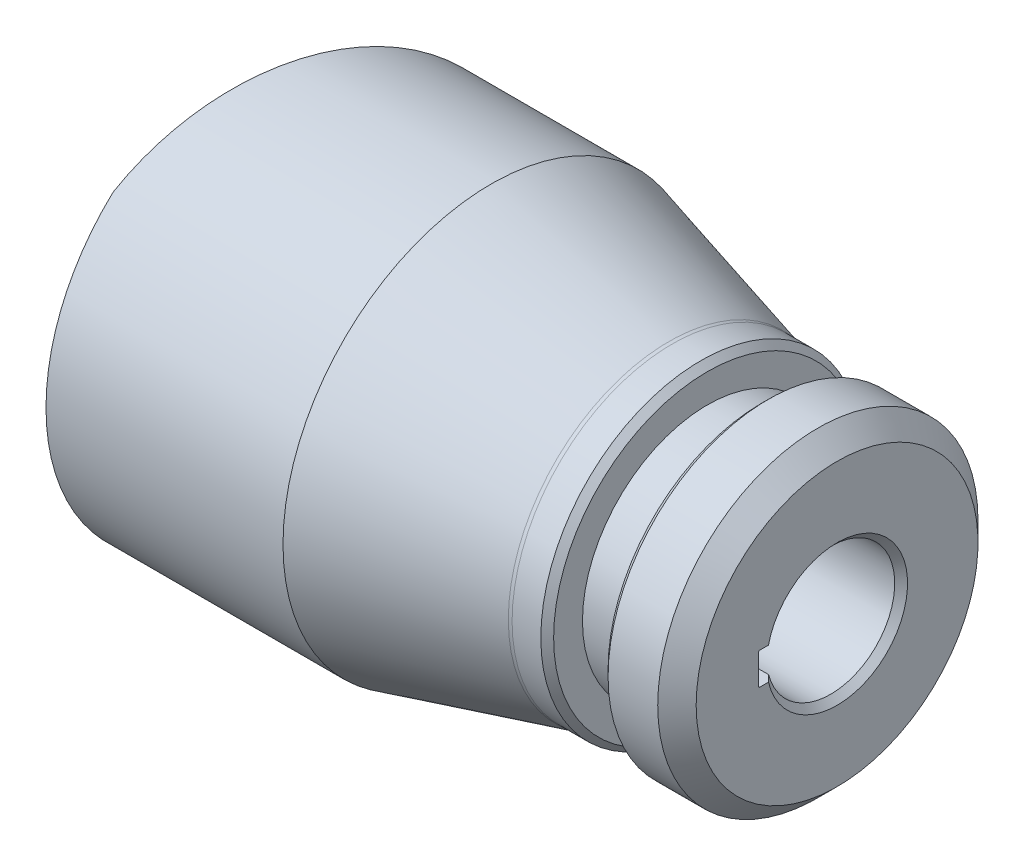
ISO-10303-21;
HEADER;
FILE_DESCRIPTION(('STEP AP214'),'2;1');
FILE_NAME('part.step','',(''),(''),'','','');
FILE_SCHEMA(('AUTOMOTIVE_DESIGN { 1 0 10303 214 1 1 1 1 }'));
ENDSEC;
DATA;
#1=APPLICATION_CONTEXT('core data for automotive mechanical design processes');
#2=APPLICATION_PROTOCOL_DEFINITION('international standard','automotive_design',2000,#1);
#3=PRODUCT_CONTEXT('',#1,'mechanical');
#4=PRODUCT('Part','Part','',(#3));
#5=PRODUCT_RELATED_PRODUCT_CATEGORY('part','',(#4));
#6=PRODUCT_DEFINITION_FORMATION('','',#4);
#7=PRODUCT_DEFINITION_CONTEXT('part definition',#1,'design');
#8=PRODUCT_DEFINITION('design','',#6,#7);
#9=PRODUCT_DEFINITION_SHAPE('','',#8);
#10=(LENGTH_UNIT() NAMED_UNIT(*) SI_UNIT(.MILLI.,.METRE.));
#11=(NAMED_UNIT(*) PLANE_ANGLE_UNIT() SI_UNIT($,.RADIAN.));
#12=(NAMED_UNIT(*) SI_UNIT($,.STERADIAN.) SOLID_ANGLE_UNIT());
#13=UNCERTAINTY_MEASURE_WITH_UNIT(LENGTH_MEASURE(1.E-05),#10,'distance_accuracy_value','');
#14=(GEOMETRIC_REPRESENTATION_CONTEXT(3) GLOBAL_UNCERTAINTY_ASSIGNED_CONTEXT((#13)) GLOBAL_UNIT_ASSIGNED_CONTEXT((#10,
#11,#12)) REPRESENTATION_CONTEXT('',''));
#15=CARTESIAN_POINT('',(0.,0.,0.));
#16=DIRECTION('',(0.,0.,1.));
#17=DIRECTION('',(1.,0.,0.));
#18=AXIS2_PLACEMENT_3D('',#15,#16,#17);
#19=CARTESIAN_POINT('',(61.,10.,0.));
#20=DIRECTION('',(1.,0.,0.));
#21=DIRECTION('',(0.,0.,-1.));
#22=AXIS2_PLACEMENT_3D('',#19,#20,#21);
#23=PLANE('',#22);
#24=CARTESIAN_POINT('',(61.,0.,0.));
#25=DIRECTION('',(-1.,0.,0.));
#26=DIRECTION('',(0.,0.,1.));
#27=AXIS2_PLACEMENT_3D('',#24,#25,#26);
#28=CIRCLE('',#27,19.);
#29=CARTESIAN_POINT('',(61.,0.,19.));
#30=VERTEX_POINT('',#29);
#31=EDGE_CURVE('E228',#30,#30,#28,.T.);
#32=ORIENTED_EDGE('',*,*,#31,.T.);
#33=EDGE_LOOP('',(#32));
#34=FACE_BOUND('',#33,.T.);
#35=CARTESIAN_POINT('',(61.,-2.25,12.05));
#36=DIRECTION('',(1.,0.,0.));
#37=DIRECTION('',(0.,0.,-1.));
#38=AXIS2_PLACEMENT_3D('',#35,#36,#37);
#39=CIRCLE('',#38,0.25);
#40=CARTESIAN_POINT('',(61.,-2.25,12.3));
#41=VERTEX_POINT('',#40);
#42=CARTESIAN_POINT('',(61.,-2.5,12.05));
#43=VERTEX_POINT('',#42);
#44=EDGE_CURVE('E137',#41,#43,#39,.T.);
#45=ORIENTED_EDGE('',*,*,#44,.T.);
#46=DIRECTION('',(0.,0.,-1.));
#47=VECTOR('',#46,1.);
#48=CARTESIAN_POINT('',(61.,-2.5,12.05));
#49=LINE('',#48,#47);
#50=CARTESIAN_POINT('',(61.,-2.5,9.68245836551854));
#51=VERTEX_POINT('',#50);
#52=EDGE_CURVE('E132',#43,#51,#49,.T.);
#53=ORIENTED_EDGE('',*,*,#52,.T.);
#54=CARTESIAN_POINT('',(61.,0.,0.));
#55=DIRECTION('',(-1.,0.,0.));
#56=DIRECTION('',(0.,0.,1.));
#57=AXIS2_PLACEMENT_3D('',#54,#55,#56);
#58=CIRCLE('',#57,10.);
#59=CARTESIAN_POINT('',(61.,2.5,9.68245836551854));
#60=VERTEX_POINT('',#59);
#61=EDGE_CURVE('E131',#60,#51,#58,.T.);
#62=ORIENTED_EDGE('',*,*,#61,.F.);
#63=DIRECTION('',(0.,0.,1.));
#64=VECTOR('',#63,1.);
#65=CARTESIAN_POINT('',(61.,2.5,0.));
#66=LINE('',#65,#64);
#67=CARTESIAN_POINT('',(61.,2.5,12.05));
#68=VERTEX_POINT('',#67);
#69=EDGE_CURVE('E115',#60,#68,#66,.T.);
#70=ORIENTED_EDGE('',*,*,#69,.T.);
#71=CARTESIAN_POINT('',(61.,2.25,12.05));
#72=DIRECTION('',(1.,0.,0.));
#73=DIRECTION('',(0.,0.,-1.));
#74=AXIS2_PLACEMENT_3D('',#71,#72,#73);
#75=CIRCLE('',#74,0.25);
#76=CARTESIAN_POINT('',(61.,2.25,12.3));
#77=VERTEX_POINT('',#76);
#78=EDGE_CURVE('E122',#68,#77,#75,.T.);
#79=ORIENTED_EDGE('',*,*,#78,.T.);
#80=DIRECTION('',(0.,-1.,0.));
#81=VECTOR('',#80,1.);
#82=CARTESIAN_POINT('',(61.,2.25,12.3));
#83=LINE('',#82,#81);
#84=EDGE_CURVE('E130',#77,#41,#83,.T.);
#85=ORIENTED_EDGE('',*,*,#84,.T.);
#86=EDGE_LOOP('',(#45,#53,#62,#70,#79,#85));
#87=FACE_BOUND('',#86,.T.);
#88=ADVANCED_FACE('F39',(#34,#87),#23,.F.);
#89=CARTESIAN_POINT('',(0.,0.,0.));
#90=DIRECTION('',(-1.,0.,0.));
#91=DIRECTION('',(0.,0.,1.));
#92=AXIS2_PLACEMENT_3D('',#89,#90,#91);
#93=CYLINDRICAL_SURFACE('',#92,10.);
#94=DIRECTION('',(-1.,0.,0.));
#95=VECTOR('',#94,1.);
#96=CARTESIAN_POINT('',(0.,-2.5,9.68245836551854));
#97=LINE('',#96,#95);
#98=CARTESIAN_POINT('',(90.,-2.5,9.68245836551854));
#99=VERTEX_POINT('',#98);
#100=EDGE_CURVE('E177',#99,#51,#97,.T.);
#101=ORIENTED_EDGE('',*,*,#100,.F.);
#102=CARTESIAN_POINT('',(90.,0.,0.));
#103=DIRECTION('',(-1.,0.,0.));
#104=DIRECTION('',(0.,0.,1.));
#105=AXIS2_PLACEMENT_3D('',#102,#103,#104);
#106=CIRCLE('',#105,10.);
#107=CARTESIAN_POINT('',(90.,2.5,9.68245836551854));
#108=VERTEX_POINT('',#107);
#109=EDGE_CURVE('E225',#108,#99,#106,.T.);
#110=ORIENTED_EDGE('',*,*,#109,.F.);
#111=DIRECTION('',(-1.,0.,0.));
#112=VECTOR('',#111,1.);
#113=CARTESIAN_POINT('',(0.,2.5,9.68245836551854));
#114=LINE('',#113,#112);
#115=EDGE_CURVE('E155',#60,#108,#114,.F.);
#116=ORIENTED_EDGE('',*,*,#115,.F.);
#117=ORIENTED_EDGE('',*,*,#61,.T.);
#118=EDGE_LOOP('',(#101,#110,#116,#117));
#119=FACE_BOUND('',#118,.T.);
#120=ADVANCED_FACE('F266',(#119),#93,.F.);
#121=CARTESIAN_POINT('',(90.,0.,0.));
#122=DIRECTION('',(1.,0.,0.));
#123=DIRECTION('',(0.,0.,-1.));
#124=AXIS2_PLACEMENT_3D('',#121,#122,#123);
#125=CONICAL_SURFACE('',#124,10.,0.785398163397447);
#126=CARTESIAN_POINT('',(102.045561017187,-2.5,21.9033504414856));
#127=CARTESIAN_POINT('',(101.449870446215,-2.5,21.3037783460764));
#128=CARTESIAN_POINT('',(100.854324898053,-2.5,20.7040619931697));
#129=CARTESIAN_POINT('',(99.6635375559575,-2.5,19.5041110312237));
#130=CARTESIAN_POINT('',(99.0682958370964,-2.5,18.9038763476916));
#131=CARTESIAN_POINT('',(97.8760221457398,-2.5,17.7005309154406));
#132=CARTESIAN_POINT('',(97.2789922658939,-2.5,17.0974180929501));
#133=CARTESIAN_POINT('',(96.0857744996463,-2.5,15.8905745919997));
#134=CARTESIAN_POINT('',(95.4895864810006,-2.5,15.2868440443333));
#135=CARTESIAN_POINT('',(94.4346485898976,-2.5,14.2167217543766));
#136=CARTESIAN_POINT('',(93.9756881287908,-2.5,13.7505376591703));
#137=CARTESIAN_POINT('',(93.0585903370607,-2.5,12.8173416722738));
#138=CARTESIAN_POINT('',(92.6004530233315,-2.5,12.3503297639757));
#139=CARTESIAN_POINT('',(91.6850309742706,-2.5,11.4148702783134));
#140=CARTESIAN_POINT('',(91.2277469954926,-2.5,10.9464219600604));
#141=CARTESIAN_POINT('',(90.3148861875787,-2.5,10.0079342569333));
#142=CARTESIAN_POINT('',(89.8593092298857,-2.5,9.53789499716365));
#143=CARTESIAN_POINT('',(88.9523494751294,-2.5,8.59711263543488));
#144=CARTESIAN_POINT('',(88.5009574133,-2.5,8.12637848838384));
#145=CARTESIAN_POINT('',(87.8269019453231,-2.5,7.4172560158198));
#146=CARTESIAN_POINT('',(87.6026883899942,-2.5,7.18034208959313));
#147=CARTESIAN_POINT('',(87.1556525924263,-2.5,6.70521258252492));
#148=CARTESIAN_POINT('',(86.9328303232039,-2.5,6.46699702709683));
#149=CARTESIAN_POINT('',(86.4893544719267,-2.5,5.98912775716134));
#150=CARTESIAN_POINT('',(86.2686984487696,-2.5,5.74947631274653));
#151=CARTESIAN_POINT('',(85.8300192665262,-2.5,5.26773614577968));
#152=CARTESIAN_POINT('',(85.6119963259971,-2.5,5.02564722392351));
#153=CARTESIAN_POINT('',(85.1799421292042,-2.5,4.53813526469688));
#154=CARTESIAN_POINT('',(84.9659088435389,-2.5,4.29271403860861));
#155=CARTESIAN_POINT('',(84.6494717760518,-2.5,3.92068538051081));
#156=CARTESIAN_POINT('',(84.544768684024,-2.5,3.7960351611092));
#157=CARTESIAN_POINT('',(84.3373550207405,-2.5,3.54509019573787));
#158=CARTESIAN_POINT('',(84.2346443575069,-2.5,3.41879552613407));
#159=CARTESIAN_POINT('',(84.0949780157451,-2.5,3.24340610425404));
#160=CARTESIAN_POINT('',(84.0568990373237,-2.5,3.19520488318342));
#161=CARTESIAN_POINT('',(83.9811594306527,-2.5,3.0984732096231));
#162=CARTESIAN_POINT('',(83.9434988117545,-2.5,3.04994274981301));
#163=CARTESIAN_POINT('',(83.8312131001724,-2.5,2.9038061080311));
#164=CARTESIAN_POINT('',(83.7572879230694,-2.5,2.80565938066392));
#165=CARTESIAN_POINT('',(83.6116206604259,-2.5,2.60736322707545));
#166=CARTESIAN_POINT('',(83.5398846990809,-2.5,2.50720928734453));
#167=CARTESIAN_POINT('',(83.3994981168775,-2.5,2.30475848848419));
#168=CARTESIAN_POINT('',(83.3308473157947,-2.5,2.20246175504244));
#169=CARTESIAN_POINT('',(83.1996821734027,-2.5,1.99846925459172));
#170=CARTESIAN_POINT('',(83.1370432716504,-2.5,1.89685410017203));
#171=CARTESIAN_POINT('',(83.0168053808059,-2.5,1.6906036686147));
#172=CARTESIAN_POINT('',(82.9592082432841,-2.5,1.58596730055157));
#173=CARTESIAN_POINT('',(82.851057399586,-2.5,1.37362506179184));
#174=CARTESIAN_POINT('',(82.800475315056,-2.5,1.26593381571607));
#175=CARTESIAN_POINT('',(82.7084728205532,-2.5,1.04675068999883));
#176=CARTESIAN_POINT('',(82.6670418539287,-2.5,0.93526336273527));
#177=CARTESIAN_POINT('',(82.6090268657202,-2.5,0.74949796271908));
#178=CARTESIAN_POINT('',(82.5888746879037,-2.5,0.676335800473273));
#179=CARTESIAN_POINT('',(82.5542738118671,-2.5,0.528644072222774));
#180=CARTESIAN_POINT('',(82.5398257733874,-2.5,0.454114349088667));
#181=CARTESIAN_POINT('',(82.5173797387102,-2.5,0.304389254153665));
#182=CARTESIAN_POINT('',(82.5093555155451,-2.5,0.229197869332127));
#183=CARTESIAN_POINT('',(82.5000968878634,-2.5,0.0783950146710749));
#184=CARTESIAN_POINT('',(82.4988621261968,-2.5,0.0027835671378271));
#185=CARTESIAN_POINT('',(82.5032552583313,-2.5,-0.148311352858782));
#186=CARTESIAN_POINT('',(82.5088899423716,-2.5,-0.223794624722243));
#187=CARTESIAN_POINT('',(82.5267161267743,-2.5,-0.373974966506095));
#188=CARTESIAN_POINT('',(82.5389080647435,-2.5,-0.448671983615511));
#189=CARTESIAN_POINT('',(82.5692990787695,-2.5,-0.597167582870771));
#190=CARTESIAN_POINT('',(82.5875248464607,-2.5,-0.670960634354447));
#191=CARTESIAN_POINT('',(82.6291922122467,-2.5,-0.817036970277688));
#192=CARTESIAN_POINT('',(82.6526340214481,-2.5,-0.889320193481054));
#193=CARTESIAN_POINT('',(82.7388087960089,-2.5,-1.12958668720317));
#194=CARTESIAN_POINT('',(82.811608747054,-2.5,-1.29398154860926));
#195=CARTESIAN_POINT('',(82.9325594311706,-2.5,-1.53449963527309));
#196=CARTESIAN_POINT('',(82.9748938967031,-2.5,-1.61375333975097));
#197=CARTESIAN_POINT('',(83.0627425706191,-2.5,-1.77048277937609));
#198=CARTESIAN_POINT('',(83.108256220561,-2.5,-1.84795882361883));
#199=CARTESIAN_POINT('',(83.2021464788311,-2.5,-2.00187005218244));
#200=CARTESIAN_POINT('',(83.2505405929618,-2.5,-2.07829444291589));
#201=CARTESIAN_POINT('',(83.3494205783412,-2.5,-2.22977791758439));
#202=CARTESIAN_POINT('',(83.3999065034323,-2.5,-2.3048369663043));
#203=CARTESIAN_POINT('',(83.502529566732,-2.5,-2.4536947089672));
#204=CARTESIAN_POINT('',(83.5546648735071,-2.5,-2.52749466982519));
#205=CARTESIAN_POINT('',(83.6603416359775,-2.5,-2.67407422188183));
#206=CARTESIAN_POINT('',(83.7138830420523,-2.5,-2.74685384894895));
#207=CARTESIAN_POINT('',(83.8878377808231,-2.5,-2.97936805377215));
#208=CARTESIAN_POINT('',(84.0105237004975,-2.5,-3.13740244992337));
#209=CARTESIAN_POINT('',(84.2598180841568,-2.5,-3.45035538054898));
#210=CARTESIAN_POINT('',(84.3864271123722,-2.5,-3.60527346149401));
#211=CARTESIAN_POINT('',(84.6425145204182,-2.5,-3.91282383803164));
#212=CARTESIAN_POINT('',(84.771994080099,-2.5,-4.06545514884034));
#213=CARTESIAN_POINT('',(85.0330425368542,-2.5,-4.36892349220322));
#214=CARTESIAN_POINT('',(85.1646115000773,-2.5,-4.51976046768493));
#215=CARTESIAN_POINT('',(85.4295419798155,-2.5,-4.82026565445455));
#216=CARTESIAN_POINT('',(85.5629059597752,-2.5,-4.96993169049384));
#217=CARTESIAN_POINT('',(85.8308764891571,-2.5,-5.2681481340376));
#218=CARTESIAN_POINT('',(85.9654830503867,-2.5,-5.41669853091656));
#219=CARTESIAN_POINT('',(86.3706936253748,-2.5,-5.86093576973548));
#220=CARTESIAN_POINT('',(86.6427595030003,-2.5,-6.15528855637171));
#221=CARTESIAN_POINT('',(87.1885779611658,-2.5,-6.74067580384861));
#222=CARTESIAN_POINT('',(87.462322460928,-2.5,-7.0317178258461));
#223=CARTESIAN_POINT('',(88.0116063644491,-2.5,-7.61213662900406));
#224=CARTESIAN_POINT('',(88.2871458804375,-2.5,-7.90151330387));
#225=CARTESIAN_POINT('',(88.8393191206114,-2.5,-8.47883478347782));
#226=CARTESIAN_POINT('',(89.1159519520669,-2.5,-8.76678044300963));
#227=CARTESIAN_POINT('',(89.6701787524352,-2.5,-9.34174536244209));
#228=CARTESIAN_POINT('',(89.9477727221698,-2.5,-9.62876462155022));
#229=CARTESIAN_POINT('',(90.3171746668332,-2.5,-10.0097262565819));
#230=CARTESIAN_POINT('',(90.4086536315667,-2.5,-10.1039879493731));
#231=CARTESIAN_POINT('',(90.5916929793254,-2.5,-10.2924469787721));
#232=CARTESIAN_POINT('',(90.6832533682993,-2.5,-10.3866443096035));
#233=CARTESIAN_POINT('',(90.866469806922,-2.5,-10.5750008769896));
#234=CARTESIAN_POINT('',(90.9581258770255,-2.5,-10.6691600936455));
#235=CARTESIAN_POINT('',(91.1414938389912,-2.5,-10.8574093402639));
#236=CARTESIAN_POINT('',(91.233205725748,-2.5,-10.9514993751995));
#237=CARTESIAN_POINT('',(91.324946718833,-2.5,-11.0455610171873));
#238=B_SPLINE_CURVE_WITH_KNOTS('',3,(#126,#127,#128,#129,#130,#131,#132,#133,#134,#135,#136,
#137,#138,#139,#140,#141,#142,#143,#144,#145,#146,#147,#148,#149,#150,#151,#152,#153,#154,#155,
#156,#157,#158,#159,#160,#161,#162,#163,#164,#165,#166,#167,#168,#169,#170,#171,#172,#173,#174,
#175,#176,#177,#178,#179,#180,#181,#182,#183,#184,#185,#186,#187,#188,#189,#190,#191,#192,#193,
#194,#195,#196,#197,#198,#199,#200,#201,#202,#203,#204,#205,#206,#207,#208,#209,#210,#211,#212,
#213,#214,#215,#216,#217,#218,#219,#220,#221,#222,#223,#224,#225,#226,#227,#228,#229,#230,#231,
#232,#233,#234,#235,#236,#237),.UNSPECIFIED.,.F.,.F.,(4,2,2,2,2,2,2,2,2,2,2,2,2,2,2,2,2,2,2,2,2,
2,2,2,2,2,2,2,2,2,2,2,2,2,2,2,2,2,2,2,2,2,2,2,2,2,2,2,2,2,2,2,2,2,2,4),(0.,2.53554854250261,
5.07155885147493,7.61747825214947,10.1629392698724,12.1255262999428,14.08815315979,
16.0520676504545,18.0158311382299,19.9723683022417,20.9509342989017,21.9294812574857,
22.9067571031813,23.884113516999,24.8609584134011,25.3493129498761,25.8376448881797,
26.0219261080066,26.2062114387111,26.5748002136115,26.9443399107132,27.3138579924631,
27.6718609859281,28.0299949079246,28.3866349314927,28.7428613641364,28.9703313064979,
29.1978275503193,29.424390173276,29.650940878109,29.8777157031423,30.1045056641634,
30.3323125806441,30.5601287187352,31.0978773208622,31.3674130075624,31.6369014673016,
31.908239552422,32.1795846260495,32.4506383064768,32.7216824343584,33.3217776621176,
33.921959601275,34.5223929774751,35.1228454008901,35.7242289945911,36.3256183087157,
37.5280763654771,38.7267226419803,39.9254445946254,41.1233341148939,42.3212246596831,
42.7152842986935,43.1093755845909,43.5035850678365,43.8977627169515),.UNSPECIFIED.);
#239=CARTESIAN_POINT('',(91.,-2.5,10.7121426428143));
#240=VERTEX_POINT('',#239);
#241=EDGE_CURVE('E168',#240,#99,#238,.T.);
#242=ORIENTED_EDGE('',*,*,#241,.F.);
#243=CARTESIAN_POINT('',(91.,0.,0.));
#244=DIRECTION('',(-1.,0.,0.));
#245=DIRECTION('',(0.,0.,1.));
#246=AXIS2_PLACEMENT_3D('',#243,#244,#245);
#247=CIRCLE('',#246,11.);
#248=CARTESIAN_POINT('',(91.,2.5,10.7121426428143));
#249=VERTEX_POINT('',#248);
#250=EDGE_CURVE('E218',#249,#240,#247,.T.);
#251=ORIENTED_EDGE('',*,*,#250,.F.);
#252=CARTESIAN_POINT('',(91.324946718833,2.5,-11.0455610171873));
#253=CARTESIAN_POINT('',(91.0264872076435,2.5,-10.7395256999951));
#254=CARTESIAN_POINT('',(90.7283116424926,2.5,-10.4332122092368));
#255=CARTESIAN_POINT('',(90.1327500336678,2.5,-9.81978495868333));
#256=CARTESIAN_POINT('',(89.8353640359402,2.5,-9.51267115429152));
#257=CARTESIAN_POINT('',(89.240959113721,2.5,-8.89673146577438));
#258=CARTESIAN_POINT('',(88.943942579579,2.5,-8.58790327325961));
#259=CARTESIAN_POINT('',(88.3513559475128,2.5,-7.96888841905438));
#260=CARTESIAN_POINT('',(88.0557857823271,2.5,-7.65870182183074));
#261=CARTESIAN_POINT('',(87.4537653644763,2.5,-7.02278984034606));
#262=CARTESIAN_POINT('',(87.1474054729947,2.5,-6.6969788350244));
#263=CARTESIAN_POINT('',(86.5379126253516,2.5,-6.04224922304472));
#264=CARTESIAN_POINT('',(86.234780147433,2.5,-5.71333016909498));
#265=CARTESIAN_POINT('',(85.7842342634438,2.5,-5.21652610534034));
#266=CARTESIAN_POINT('',(85.6348284484134,2.5,-5.05044950544328));
#267=CARTESIAN_POINT('',(85.3377706338616,2.5,-4.71673691747359));
#268=CARTESIAN_POINT('',(85.1901186024667,2.5,-4.54910095783998));
#269=CARTESIAN_POINT('',(84.8971949044248,2.5,-4.21182900344743));
#270=CARTESIAN_POINT('',(84.7519226757172,2.5,-4.04219349770228));
#271=CARTESIAN_POINT('',(84.464622272545,2.5,-3.70020282272686));
#272=CARTESIAN_POINT('',(84.3225938333821,2.5,-3.52784787736185));
#273=CARTESIAN_POINT('',(84.1284670508829,2.5,-3.28570678840755));
#274=CARTESIAN_POINT('',(84.0743810891246,2.5,-3.21751403348742));
#275=CARTESIAN_POINT('',(83.9670491665562,2.5,-3.08046981518376));
#276=CARTESIAN_POINT('',(83.9138032172655,2.5,-3.01161834278778));
#277=CARTESIAN_POINT('',(83.7554983903631,2.5,-2.8038986038655));
#278=CARTESIAN_POINT('',(83.6519033689274,2.5,-2.66390318690655));
#279=CARTESIAN_POINT('',(83.4504837086314,2.5,-2.38029171591086));
#280=CARTESIAN_POINT('',(83.352646089999,2.5,-2.23668493659416));
#281=CARTESIAN_POINT('',(83.165062902916,2.5,-1.94428749240061));
#282=CARTESIAN_POINT('',(83.0753128044882,2.5,-1.79549979502898));
#283=CARTESIAN_POINT('',(82.9479157288535,2.5,-1.56352283046052));
#284=CARTESIAN_POINT('',(82.9057978086178,2.5,-1.48280885282083));
#285=CARTESIAN_POINT('',(82.8258494063597,2.5,-1.31929389468974));
#286=CARTESIAN_POINT('',(82.788019757904,2.5,-1.23649251225311));
#287=CARTESIAN_POINT('',(82.682746618178,2.5,-0.984983944724189));
#288=CARTESIAN_POINT('',(82.6232158308722,2.5,-0.812648480153105));
#289=CARTESIAN_POINT('',(82.5620315512805,2.5,-0.564670141277329));
#290=CARTESIAN_POINT('',(82.5469881264684,2.5,-0.492267812610079));
#291=CARTESIAN_POINT('',(82.5228705971666,2.5,-0.346461869982659));
#292=CARTESIAN_POINT('',(82.5137956104057,2.5,-0.273058405651397));
#293=CARTESIAN_POINT('',(82.5020891370418,2.5,-0.125814800388735));
#294=CARTESIAN_POINT('',(82.49945063952,2.5,-0.0519752224862423));
#295=CARTESIAN_POINT('',(82.5007400953475,2.5,0.0956488420215832));
#296=CARTESIAN_POINT('',(82.5046682627275,2.5,0.169433326752817));
#297=CARTESIAN_POINT('',(82.5188519310274,2.5,0.316112946878502));
#298=CARTESIAN_POINT('',(82.5290845487675,2.5,0.389010330713581));
#299=CARTESIAN_POINT('',(82.5553522179659,2.5,0.533755748715104));
#300=CARTESIAN_POINT('',(82.5713886925071,2.5,0.605603521021994));
#301=CARTESIAN_POINT('',(82.608613890447,2.5,0.748068073568038));
#302=CARTESIAN_POINT('',(82.6298114280324,2.5,0.818682524015744));
#303=CARTESIAN_POINT('',(82.6766074057769,2.5,0.958416472111447));
#304=CARTESIAN_POINT('',(82.702205609798,2.5,1.02753604974985));
#305=CARTESIAN_POINT('',(82.7690889539855,2.5,1.1941338484557));
#306=CARTESIAN_POINT('',(82.8123437215069,2.5,1.29081901114142));
#307=CARTESIAN_POINT('',(82.9047330688297,2.5,1.48135829785574));
#308=CARTESIAN_POINT('',(82.9538709852571,2.5,1.57521077718962));
#309=CARTESIAN_POINT('',(83.056757209002,2.5,1.76060266320425));
#310=CARTESIAN_POINT('',(83.1105153562385,2.5,1.85213656724629));
#311=CARTESIAN_POINT('',(83.2215091626245,2.5,2.03303196308019));
#312=CARTESIAN_POINT('',(83.2787441610631,2.5,2.12239386313003));
#313=CARTESIAN_POINT('',(83.396472772813,2.5,2.30010785455569));
#314=CARTESIAN_POINT('',(83.4569912853469,2.5,2.38844337389955));
#315=CARTESIAN_POINT('',(83.5802248388906,2.5,2.56356740759901));
#316=CARTESIAN_POINT('',(83.6429399571936,2.5,2.65035586735488));
#317=CARTESIAN_POINT('',(83.7700428684859,2.5,2.82251489467904));
#318=CARTESIAN_POINT('',(83.8344282920167,2.5,2.90788721633357));
#319=CARTESIAN_POINT('',(83.9646245473037,2.5,3.07753049630983));
#320=CARTESIAN_POINT('',(84.0304353303801,2.5,3.16180149208773));
#321=CARTESIAN_POINT('',(84.2485695576563,2.5,3.43716353705055));
#322=CARTESIAN_POINT('',(84.4033487308776,2.5,3.62630869256808));
#323=CARTESIAN_POINT('',(84.7169317793855,2.5,4.00124114897501));
#324=CARTESIAN_POINT('',(84.8757361207144,2.5,4.18702805673399));
#325=CARTESIAN_POINT('',(85.1962160599706,2.5,4.55621051523594));
#326=CARTESIAN_POINT('',(85.3578925812074,2.5,4.73960526287758));
#327=CARTESIAN_POINT('',(85.6832933472581,2.5,5.10457000516818));
#328=CARTESIAN_POINT('',(85.8470176287429,2.5,5.28613996703398));
#329=CARTESIAN_POINT('',(86.1762229544659,2.5,5.64813248817901));
#330=CARTESIAN_POINT('',(86.3417060955326,2.5,5.82855313804915));
#331=CARTESIAN_POINT('',(86.673855857512,2.5,6.18830389501986));
#332=CARTESIAN_POINT('',(86.8405224907561,2.5,6.36763399072128));
#333=CARTESIAN_POINT('',(87.3418285009866,2.5,6.90426382175186));
#334=CARTESIAN_POINT('',(87.6778429431362,2.5,7.26027844871709));
#335=CARTESIAN_POINT('',(88.3501416787804,2.5,7.96786303434974));
#336=CARTESIAN_POINT('',(88.6864114140159,2.5,8.31944686452891));
#337=CARTESIAN_POINT('',(89.3605809022521,2.5,9.02108172216437));
#338=CARTESIAN_POINT('',(89.6984807373123,2.5,9.37113267072663));
#339=CARTESIAN_POINT('',(90.3752045818812,2.5,10.0698766221887));
#340=CARTESIAN_POINT('',(90.7140278038831,2.5,10.4185703884251));
#341=CARTESIAN_POINT('',(91.392526097637,2.5,11.115117762963));
#342=CARTESIAN_POINT('',(91.7322011567124,2.5,11.4629713836178));
#343=CARTESIAN_POINT('',(92.4845687547211,2.5,12.2320108764457));
#344=CARTESIAN_POINT('',(92.8974146866384,2.5,12.6530466384443));
#345=CARTESIAN_POINT('',(93.7238191781225,2.5,13.4944215464866));
#346=CARTESIAN_POINT('',(94.1373777407934,2.5,13.9147606894802));
#347=CARTESIAN_POINT('',(95.3790536830222,2.5,15.17518830171));
#348=CARTESIAN_POINT('',(96.2079740135092,2.5,16.0144856480676));
#349=CARTESIAN_POINT('',(97.8712770869717,2.5,17.6959779203467));
#350=CARTESIAN_POINT('',(98.7056664094186,2.5,18.5381663331123));
#351=CARTESIAN_POINT('',(99.9578113322211,2.5,19.8006843471737));
#352=CARTESIAN_POINT('',(100.375234375045,2.5,20.2213438420664));
#353=CARTESIAN_POINT('',(101.210266712846,2.5,21.0624774530978));
#354=CARTESIAN_POINT('',(101.627876007715,2.5,21.4829515693434));
#355=CARTESIAN_POINT('',(102.045561017187,2.5,21.9033504414856));
#356=B_SPLINE_CURVE_WITH_KNOTS('',3,(#252,#253,#254,#255,#256,#257,#258,#259,#260,#261,#262,
#263,#264,#265,#266,#267,#268,#269,#270,#271,#272,#273,#274,#275,#276,#277,#278,#279,#280,#281,
#282,#283,#284,#285,#286,#287,#288,#289,#290,#291,#292,#293,#294,#295,#296,#297,#298,#299,#300,
#301,#302,#303,#304,#305,#306,#307,#308,#309,#310,#311,#312,#313,#314,#315,#316,#317,#318,#319,
#320,#321,#322,#323,#324,#325,#326,#327,#328,#329,#330,#331,#332,#333,#334,#335,#336,#337,#338,
#339,#340,#341,#342,#343,#344,#345,#346,#347,#348,#349,#350,#351,#352,#353,#354,#355),
.UNSPECIFIED.,.F.,.F.,(4,2,2,2,2,2,2,2,2,2,2,2,2,2,2,2,2,2,2,2,2,2,2,2,2,2,2,2,2,2,2,2,2,2,2,2,
2,2,2,2,2,2,2,2,2,2,2,2,2,2,2,4),(0.,1.28242905949621,2.56493117830289,3.85036297343735,
5.13573441203459,6.47739444809818,7.81925060120181,8.48941487904222,9.15956695854572,
9.82955841108419,10.4994949945004,10.7606018720145,11.0217123270701,11.5440804048788,
12.0652217603739,12.5860693760987,12.8590728547271,13.1321293098985,13.6764349544331,
13.8980803070749,14.11969288811,14.3410639705764,14.5624422684444,14.783021728054,
15.0036553095655,15.2246683704846,15.4456695756223,15.7631522991369,16.0808159435135,
16.3991737415265,16.7174712296704,17.0386631373686,17.3598663584041,17.680636469648,
18.0013956429425,18.7345035471117,19.4676967232841,20.2011300217109,20.934576473152,
21.6690262650512,22.403483720725,23.8720922374743,25.3316057200061,26.7911934577999,
28.2497856993581,29.7083563622546,31.4773706973252,33.2463927576,36.7852824960725,
40.3418786679764,42.1197334091946,43.8975871226463),.UNSPECIFIED.);
#357=EDGE_CURVE('E120',#108,#249,#356,.T.);
#358=ORIENTED_EDGE('',*,*,#357,.F.);
#359=ORIENTED_EDGE('',*,*,#109,.T.);
#360=EDGE_LOOP('',(#242,#251,#358,#359));
#361=FACE_BOUND('',#360,.T.);
#362=ADVANCED_FACE('F152',(#361),#125,.F.);
#363=CARTESIAN_POINT('',(0.,27.5,0.));
#364=DIRECTION('',(1.,0.,0.));
#365=DIRECTION('',(0.,0.,-1.));
#366=AXIS2_PLACEMENT_3D('',#363,#364,#365);
#367=PLANE('',#366);
#368=CARTESIAN_POINT('',(0.,0.,0.));
#369=DIRECTION('',(-1.,0.,0.));
#370=DIRECTION('',(0.,0.,1.));
#371=AXIS2_PLACEMENT_3D('',#368,#369,#370);
#372=CIRCLE('',#371,32.5);
#373=CARTESIAN_POINT('',(0.,-23.9217474278114,22.));
#374=VERTEX_POINT('',#373);
#375=CARTESIAN_POINT('',(0.,23.9217474278114,22.));
#376=VERTEX_POINT('',#375);
#377=EDGE_CURVE('E181',#374,#376,#372,.T.);
#378=ORIENTED_EDGE('',*,*,#377,.T.);
#379=DIRECTION('',(0.,-1.,0.));
#380=VECTOR('',#379,1.);
#381=CARTESIAN_POINT('',(0.,27.5,22.));
#382=LINE('',#381,#380);
#383=CARTESIAN_POINT('',(0.,16.5,22.));
#384=VERTEX_POINT('',#383);
#385=EDGE_CURVE('E182',#376,#384,#382,.T.);
#386=ORIENTED_EDGE('',*,*,#385,.T.);
#387=CARTESIAN_POINT('',(0.,0.,0.));
#388=DIRECTION('',(-1.,0.,0.));
#389=DIRECTION('',(0.,0.,1.));
#390=AXIS2_PLACEMENT_3D('',#387,#388,#389);
#391=CIRCLE('',#390,27.5);
#392=CARTESIAN_POINT('',(0.,-16.5,22.));
#393=VERTEX_POINT('',#392);
#394=EDGE_CURVE('E243',#393,#384,#391,.T.);
#395=ORIENTED_EDGE('',*,*,#394,.F.);
#396=EDGE_CURVE('E179',#393,#374,#382,.T.);
#397=ORIENTED_EDGE('',*,*,#396,.T.);
#398=EDGE_LOOP('',(#378,#386,#395,#397));
#399=FACE_BOUND('',#398,.T.);
#400=ADVANCED_FACE('F41',(#399),#367,.F.);
#401=CARTESIAN_POINT('',(0.,0.,0.));
#402=DIRECTION('',(-1.,0.,0.));
#403=DIRECTION('',(0.,0.,1.));
#404=AXIS2_PLACEMENT_3D('',#401,#402,#403);
#405=CYLINDRICAL_SURFACE('',#404,27.5);
#406=CARTESIAN_POINT('',(24.6,0.,0.));
#407=DIRECTION('',(-1.,0.,0.));
#408=DIRECTION('',(0.,0.,1.));
#409=AXIS2_PLACEMENT_3D('',#406,#407,#408);
#410=CIRCLE('',#409,27.5);
#411=CARTESIAN_POINT('',(24.6,0.,27.5));
#412=VERTEX_POINT('',#411);
#413=EDGE_CURVE('E236',#412,#412,#410,.T.);
#414=ORIENTED_EDGE('',*,*,#413,.F.);
#415=EDGE_LOOP('',(#414));
#416=FACE_BOUND('',#415,.T.);
#417=ORIENTED_EDGE('',*,*,#394,.T.);
#418=CARTESIAN_POINT('',(4.67624435674049,0.,0.));
#419=DIRECTION('',(0.978147600733805,0.,0.207911690817759));
#420=DIRECTION('',(-0.207911690817759,0.,0.978147600733806));
#421=AXIS2_PLACEMENT_3D('',#418,#419,#420);
#422=ELLIPSE('',#421,28.1143663587883,27.5);
#423=EDGE_CURVE('E65',#384,#393,#422,.F.);
#424=ORIENTED_EDGE('',*,*,#423,.T.);
#425=EDGE_LOOP('',(#417,#424));
#426=FACE_BOUND('',#425,.T.);
#427=ADVANCED_FACE('F280',(#416,#426),#405,.F.);
#428=CARTESIAN_POINT('',(24.6,0.,0.));
#429=DIRECTION('',(-1.,0.,0.));
#430=DIRECTION('',(0.,0.,1.));
#431=AXIS2_PLACEMENT_3D('',#428,#429,#430);
#432=TOROIDAL_SURFACE('',#431,27.1,0.399999999999999);
#433=CARTESIAN_POINT('',(25.,0.,0.));
#434=DIRECTION('',(-1.,0.,0.));
#435=DIRECTION('',(0.,0.,1.));
#436=AXIS2_PLACEMENT_3D('',#433,#434,#435);
#437=CIRCLE('',#436,27.1);
#438=CARTESIAN_POINT('',(25.,0.,27.1));
#439=VERTEX_POINT('',#438);
#440=EDGE_CURVE('E233',#439,#439,#437,.T.);
#441=ORIENTED_EDGE('',*,*,#440,.F.);
#442=EDGE_LOOP('',(#441));
#443=FACE_BOUND('',#442,.T.);
#444=ORIENTED_EDGE('',*,*,#413,.T.);
#445=EDGE_LOOP('',(#444));
#446=FACE_BOUND('',#445,.T.);
#447=ADVANCED_FACE('F300',(#443,#446),#432,.F.);
#448=CARTESIAN_POINT('',(25.,20.,0.));
#449=DIRECTION('',(1.,0.,0.));
#450=DIRECTION('',(0.,0.,-1.));
#451=AXIS2_PLACEMENT_3D('',#448,#449,#450);
#452=PLANE('',#451);
#453=CARTESIAN_POINT('',(25.,0.,0.));
#454=DIRECTION('',(-1.,0.,0.));
#455=DIRECTION('',(0.,0.,1.));
#456=AXIS2_PLACEMENT_3D('',#453,#454,#455);
#457=CIRCLE('',#456,20.);
#458=CARTESIAN_POINT('',(25.,0.,20.));
#459=VERTEX_POINT('',#458);
#460=EDGE_CURVE('E235',#459,#459,#457,.T.);
#461=ORIENTED_EDGE('',*,*,#460,.F.);
#462=EDGE_LOOP('',(#461));
#463=FACE_BOUND('',#462,.T.);
#464=ORIENTED_EDGE('',*,*,#440,.T.);
#465=EDGE_LOOP('',(#464));
#466=FACE_BOUND('',#465,.T.);
#467=ADVANCED_FACE('F291',(#463,#466),#452,.F.);
#468=CARTESIAN_POINT('',(0.,0.,0.));
#469=DIRECTION('',(-1.,0.,0.));
#470=DIRECTION('',(0.,0.,1.));
#471=AXIS2_PLACEMENT_3D('',#468,#469,#470);
#472=CYLINDRICAL_SURFACE('',#471,20.);
#473=CARTESIAN_POINT('',(60.,0.,0.));
#474=DIRECTION('',(-1.,0.,0.));
#475=DIRECTION('',(0.,0.,1.));
#476=AXIS2_PLACEMENT_3D('',#473,#474,#475);
#477=CIRCLE('',#476,20.);
#478=CARTESIAN_POINT('',(60.,0.,20.));
#479=VERTEX_POINT('',#478);
#480=EDGE_CURVE('E227',#479,#479,#477,.T.);
#481=ORIENTED_EDGE('',*,*,#480,.F.);
#482=EDGE_LOOP('',(#481));
#483=FACE_BOUND('',#482,.T.);
#484=ORIENTED_EDGE('',*,*,#460,.T.);
#485=EDGE_LOOP('',(#484));
#486=FACE_BOUND('',#485,.T.);
#487=ADVANCED_FACE('F286',(#483,#486),#472,.F.);
#488=CARTESIAN_POINT('',(60.,0.,0.));
#489=DIRECTION('',(-1.,0.,0.));
#490=DIRECTION('',(0.,0.,1.));
#491=AXIS2_PLACEMENT_3D('',#488,#489,#490);
#492=TOROIDAL_SURFACE('',#491,19.,1.);
#493=ORIENTED_EDGE('',*,*,#31,.F.);
#494=EDGE_LOOP('',(#493));
#495=FACE_BOUND('',#494,.T.);
#496=ORIENTED_EDGE('',*,*,#480,.T.);
#497=EDGE_LOOP('',(#496));
#498=FACE_BOUND('',#497,.T.);
#499=ADVANCED_FACE('F287',(#495,#498),#492,.F.);
#500=CARTESIAN_POINT('',(91.,22.,0.));
#501=DIRECTION('',(-1.,0.,0.));
#502=DIRECTION('',(0.,0.,1.));
#503=AXIS2_PLACEMENT_3D('',#500,#501,#502);
#504=PLANE('',#503);
#505=DIRECTION('',(0.,0.,-1.));
#506=VECTOR('',#505,1.);
#507=CARTESIAN_POINT('',(91.,-2.5,0.));
#508=LINE('',#507,#506);
#509=CARTESIAN_POINT('',(91.,-2.5,12.05));
#510=VERTEX_POINT('',#509);
#511=EDGE_CURVE('E11',#510,#240,#508,.T.);
#512=ORIENTED_EDGE('',*,*,#511,.F.);
#513=CARTESIAN_POINT('',(91.,-2.25,12.05));
#514=DIRECTION('',(-1.,0.,0.));
#515=DIRECTION('',(0.,0.,1.));
#516=AXIS2_PLACEMENT_3D('',#513,#514,#515);
#517=CIRCLE('',#516,0.25);
#518=CARTESIAN_POINT('',(91.,-2.25,12.3));
#519=VERTEX_POINT('',#518);
#520=EDGE_CURVE('E250',#519,#510,#517,.F.);
#521=ORIENTED_EDGE('',*,*,#520,.F.);
#522=DIRECTION('',(0.,-1.,0.));
#523=VECTOR('',#522,1.);
#524=CARTESIAN_POINT('',(91.,22.,12.3));
#525=LINE('',#524,#523);
#526=CARTESIAN_POINT('',(91.,2.25,12.3));
#527=VERTEX_POINT('',#526);
#528=EDGE_CURVE('E247',#527,#519,#525,.T.);
#529=ORIENTED_EDGE('',*,*,#528,.F.);
#530=CARTESIAN_POINT('',(91.,2.25,12.05));
#531=DIRECTION('',(-1.,0.,0.));
#532=DIRECTION('',(0.,0.,1.));
#533=AXIS2_PLACEMENT_3D('',#530,#531,#532);
#534=CIRCLE('',#533,0.25);
#535=CARTESIAN_POINT('',(91.,2.5,12.05));
#536=VERTEX_POINT('',#535);
#537=EDGE_CURVE('E253',#536,#527,#534,.F.);
#538=ORIENTED_EDGE('',*,*,#537,.F.);
#539=DIRECTION('',(0.,0.,1.));
#540=VECTOR('',#539,1.);
#541=CARTESIAN_POINT('',(91.,2.5,0.));
#542=LINE('',#541,#540);
#543=EDGE_CURVE('E50',#249,#536,#542,.T.);
#544=ORIENTED_EDGE('',*,*,#543,.F.);
#545=ORIENTED_EDGE('',*,*,#250,.T.);
#546=EDGE_LOOP('',(#512,#521,#529,#538,#544,#545));
#547=FACE_BOUND('',#546,.T.);
#548=CARTESIAN_POINT('',(91.,0.,0.));
#549=DIRECTION('',(-1.,0.,0.));
#550=DIRECTION('',(0.,0.,1.));
#551=AXIS2_PLACEMENT_3D('',#548,#549,#550);
#552=CIRCLE('',#551,22.);
#553=CARTESIAN_POINT('',(91.,0.,22.));
#554=VERTEX_POINT('',#553);
#555=EDGE_CURVE('E216',#554,#554,#552,.T.);
#556=ORIENTED_EDGE('',*,*,#555,.F.);
#557=EDGE_LOOP('',(#556));
#558=FACE_BOUND('',#557,.T.);
#559=ADVANCED_FACE('F256',(#547,#558),#504,.F.);
#560=CARTESIAN_POINT('',(91.,0.,0.));
#561=DIRECTION('',(-1.,0.,0.));
#562=DIRECTION('',(0.,0.,1.));
#563=AXIS2_PLACEMENT_3D('',#560,#561,#562);
#564=CONICAL_SURFACE('',#563,22.,0.785398163397448);
#565=CARTESIAN_POINT('',(88.,0.,0.));
#566=DIRECTION('',(-1.,0.,0.));
#567=DIRECTION('',(0.,0.,1.));
#568=AXIS2_PLACEMENT_3D('',#565,#566,#567);
#569=CIRCLE('',#568,25.);
#570=CARTESIAN_POINT('',(88.,0.,25.));
#571=VERTEX_POINT('',#570);
#572=EDGE_CURVE('E213',#571,#571,#569,.T.);
#573=ORIENTED_EDGE('',*,*,#572,.F.);
#574=EDGE_LOOP('',(#573));
#575=FACE_BOUND('',#574,.T.);
#576=ORIENTED_EDGE('',*,*,#555,.T.);
#577=EDGE_LOOP('',(#576));
#578=FACE_BOUND('',#577,.T.);
#579=ADVANCED_FACE('F368',(#575,#578),#564,.T.);
#580=CARTESIAN_POINT('',(0.,0.,0.));
#581=DIRECTION('',(-1.,0.,0.));
#582=DIRECTION('',(0.,0.,1.));
#583=AXIS2_PLACEMENT_3D('',#580,#581,#582);
#584=CYLINDRICAL_SURFACE('',#583,25.);
#585=CARTESIAN_POINT('',(80.25,0.,0.));
#586=DIRECTION('',(-1.,0.,0.));
#587=DIRECTION('',(0.,0.,1.));
#588=AXIS2_PLACEMENT_3D('',#585,#586,#587);
#589=CIRCLE('',#588,25.);
#590=CARTESIAN_POINT('',(80.25,0.,25.));
#591=VERTEX_POINT('',#590);
#592=EDGE_CURVE('E209',#591,#591,#589,.T.);
#593=ORIENTED_EDGE('',*,*,#592,.F.);
#594=EDGE_LOOP('',(#593));
#595=FACE_BOUND('',#594,.T.);
#596=ORIENTED_EDGE('',*,*,#572,.T.);
#597=EDGE_LOOP('',(#596));
#598=FACE_BOUND('',#597,.T.);
#599=ADVANCED_FACE('F359',(#595,#598),#584,.T.);
#600=CARTESIAN_POINT('',(80.25,0.,0.));
#601=DIRECTION('',(1.,0.,0.));
#602=DIRECTION('',(0.,0.,-1.));
#603=AXIS2_PLACEMENT_3D('',#600,#601,#602);
#604=CONICAL_SURFACE('',#603,25.,0.785398163397448);
#605=CARTESIAN_POINT('',(79.25,0.,0.));
#606=DIRECTION('',(-1.,0.,0.));
#607=DIRECTION('',(0.,0.,1.));
#608=AXIS2_PLACEMENT_3D('',#605,#606,#607);
#609=CIRCLE('',#608,24.);
#610=CARTESIAN_POINT('',(79.25,0.,24.));
#611=VERTEX_POINT('',#610);
#612=EDGE_CURVE('E210',#611,#611,#609,.T.);
#613=ORIENTED_EDGE('',*,*,#612,.F.);
#614=EDGE_LOOP('',(#613));
#615=FACE_BOUND('',#614,.T.);
#616=ORIENTED_EDGE('',*,*,#592,.T.);
#617=EDGE_LOOP('',(#616));
#618=FACE_BOUND('',#617,.T.);
#619=ADVANCED_FACE('F352',(#615,#618),#604,.T.);
#620=CARTESIAN_POINT('',(79.25,19.4999958169038,0.));
#621=DIRECTION('',(1.,0.,0.));
#622=DIRECTION('',(0.,0.,-1.));
#623=AXIS2_PLACEMENT_3D('',#620,#621,#622);
#624=PLANE('',#623);
#625=CARTESIAN_POINT('',(79.25,0.,0.));
#626=DIRECTION('',(-1.,0.,0.));
#627=DIRECTION('',(0.,0.,1.));
#628=AXIS2_PLACEMENT_3D('',#625,#626,#627);
#629=CIRCLE('',#628,19.4999958169038);
#630=CARTESIAN_POINT('',(79.25,0.,19.4999958169038));
#631=VERTEX_POINT('',#630);
#632=EDGE_CURVE('E204',#631,#631,#629,.T.);
#633=ORIENTED_EDGE('',*,*,#632,.F.);
#634=EDGE_LOOP('',(#633));
#635=FACE_BOUND('',#634,.T.);
#636=ORIENTED_EDGE('',*,*,#612,.T.);
#637=EDGE_LOOP('',(#636));
#638=FACE_BOUND('',#637,.T.);
#639=ADVANCED_FACE('F346',(#635,#638),#624,.F.);
#640=CARTESIAN_POINT('',(0.,0.,0.));
#641=DIRECTION('',(-1.,0.,0.));
#642=DIRECTION('',(0.,0.,1.));
#643=AXIS2_PLACEMENT_3D('',#640,#641,#642);
#644=CYLINDRICAL_SURFACE('',#643,19.4999958169038);
#645=CARTESIAN_POINT('',(70.7499994494134,0.,0.));
#646=DIRECTION('',(-1.,0.,0.));
#647=DIRECTION('',(0.,0.,1.));
#648=AXIS2_PLACEMENT_3D('',#645,#646,#647);
#649=CIRCLE('',#648,19.4999958169038);
#650=CARTESIAN_POINT('',(70.7499994494134,0.,19.4999958169038));
#651=VERTEX_POINT('',#650);
#652=EDGE_CURVE('E203',#651,#651,#649,.T.);
#653=ORIENTED_EDGE('',*,*,#652,.F.);
#654=EDGE_LOOP('',(#653));
#655=FACE_BOUND('',#654,.T.);
#656=ORIENTED_EDGE('',*,*,#632,.T.);
#657=EDGE_LOOP('',(#656));
#658=FACE_BOUND('',#657,.T.);
#659=ADVANCED_FACE('F345',(#655,#658),#644,.T.);
#660=CARTESIAN_POINT('',(70.7499994494134,23.9999958169038,0.));
#661=DIRECTION('',(-1.,0.,0.));
#662=DIRECTION('',(0.,0.,1.));
#663=AXIS2_PLACEMENT_3D('',#660,#661,#662);
#664=PLANE('',#663);
#665=CARTESIAN_POINT('',(70.7499994494134,0.,0.));
#666=DIRECTION('',(-1.,0.,0.));
#667=DIRECTION('',(0.,0.,1.));
#668=AXIS2_PLACEMENT_3D('',#665,#666,#667);
#669=CIRCLE('',#668,23.9999958169038);
#670=CARTESIAN_POINT('',(70.7499994494134,0.,23.9999958169038));
#671=VERTEX_POINT('',#670);
#672=EDGE_CURVE('E196',#671,#671,#669,.T.);
#673=ORIENTED_EDGE('',*,*,#672,.F.);
#674=EDGE_LOOP('',(#673));
#675=FACE_BOUND('',#674,.T.);
#676=ORIENTED_EDGE('',*,*,#652,.T.);
#677=EDGE_LOOP('',(#676));
#678=FACE_BOUND('',#677,.T.);
#679=ADVANCED_FACE('F338',(#675,#678),#664,.F.);
#680=CARTESIAN_POINT('',(70.7499994494134,0.,0.));
#681=DIRECTION('',(-1.,0.,0.));
#682=DIRECTION('',(0.,0.,1.));
#683=AXIS2_PLACEMENT_3D('',#680,#681,#682);
#684=CONICAL_SURFACE('',#683,23.9999958169038,0.785398163397452);
#685=CARTESIAN_POINT('',(69.7499994494134,0.,0.));
#686=DIRECTION('',(-1.,0.,0.));
#687=DIRECTION('',(0.,0.,1.));
#688=AXIS2_PLACEMENT_3D('',#685,#686,#687);
#689=CIRCLE('',#688,24.9999958169038);
#690=CARTESIAN_POINT('',(69.7499994494134,0.,24.9999958169038));
#691=VERTEX_POINT('',#690);
#692=EDGE_CURVE('E194',#691,#691,#689,.T.);
#693=ORIENTED_EDGE('',*,*,#692,.F.);
#694=EDGE_LOOP('',(#693));
#695=FACE_BOUND('',#694,.T.);
#696=ORIENTED_EDGE('',*,*,#672,.T.);
#697=EDGE_LOOP('',(#696));
#698=FACE_BOUND('',#697,.T.);
#699=ADVANCED_FACE('F329',(#695,#698),#684,.T.);
#700=CARTESIAN_POINT('',(0.,0.,0.));
#701=DIRECTION('',(-1.,0.,0.));
#702=DIRECTION('',(0.,0.,1.));
#703=AXIS2_PLACEMENT_3D('',#700,#701,#702);
#704=CYLINDRICAL_SURFACE('',#703,24.9999958169038);
#705=CARTESIAN_POINT('',(65.2632170494134,0.,0.));
#706=DIRECTION('',(-1.,0.,0.));
#707=DIRECTION('',(0.,0.,1.));
#708=AXIS2_PLACEMENT_3D('',#705,#706,#707);
#709=CIRCLE('',#708,24.9999958169038);
#710=CARTESIAN_POINT('',(65.2632170494134,0.,24.9999958169038));
#711=VERTEX_POINT('',#710);
#712=EDGE_CURVE('E195',#711,#711,#709,.T.);
#713=ORIENTED_EDGE('',*,*,#712,.F.);
#714=EDGE_LOOP('',(#713));
#715=FACE_BOUND('',#714,.T.);
#716=ORIENTED_EDGE('',*,*,#692,.T.);
#717=EDGE_LOOP('',(#716));
#718=FACE_BOUND('',#717,.T.);
#719=ADVANCED_FACE('F322',(#715,#718),#704,.T.);
#720=CARTESIAN_POINT('',(65.2632170494134,0.,0.));
#721=DIRECTION('',(-1.,0.,0.));
#722=DIRECTION('',(0.,0.,1.));
#723=AXIS2_PLACEMENT_3D('',#720,#721,#722);
#724=TOROIDAL_SURFACE('',#723,26.9999979446865,2.00000212778271);
#725=CARTESIAN_POINT('',(64.745695,0.,0.));
#726=DIRECTION('',(-1.,0.,0.));
#727=DIRECTION('',(0.,0.,1.));
#728=AXIS2_PLACEMENT_3D('',#725,#726,#727);
#729=CIRCLE('',#728,25.068113);
#730=CARTESIAN_POINT('',(64.745695,0.,25.068113));
#731=VERTEX_POINT('',#730);
#732=EDGE_CURVE('E187',#731,#731,#729,.T.);
#733=ORIENTED_EDGE('',*,*,#732,.F.);
#734=EDGE_LOOP('',(#733));
#735=FACE_BOUND('',#734,.T.);
#736=ORIENTED_EDGE('',*,*,#712,.T.);
#737=EDGE_LOOP('',(#736));
#738=FACE_BOUND('',#737,.T.);
#739=ADVANCED_FACE('F318',(#735,#738),#724,.F.);
#740=CARTESIAN_POINT('',(64.745695,0.,0.));
#741=DIRECTION('',(-1.,0.,0.));
#742=DIRECTION('',(0.,0.,1.));
#743=AXIS2_PLACEMENT_3D('',#740,#741,#742);
#744=CONICAL_SURFACE('',#743,25.068113,0.26171365072842);
#745=CARTESIAN_POINT('',(37.,0.,0.));
#746=DIRECTION('',(-1.,0.,0.));
#747=DIRECTION('',(0.,0.,1.));
#748=AXIS2_PLACEMENT_3D('',#745,#746,#747);
#749=CIRCLE('',#748,32.5);
#750=CARTESIAN_POINT('',(37.,0.,32.5));
#751=VERTEX_POINT('',#750);
#752=EDGE_CURVE('E188',#751,#751,#749,.T.);
#753=ORIENTED_EDGE('',*,*,#752,.F.);
#754=EDGE_LOOP('',(#753));
#755=FACE_BOUND('',#754,.T.);
#756=ORIENTED_EDGE('',*,*,#732,.T.);
#757=EDGE_LOOP('',(#756));
#758=FACE_BOUND('',#757,.T.);
#759=ADVANCED_FACE('F311',(#755,#758),#744,.T.);
#760=CARTESIAN_POINT('',(0.,0.,0.));
#761=DIRECTION('',(-1.,0.,0.));
#762=DIRECTION('',(0.,0.,1.));
#763=AXIS2_PLACEMENT_3D('',#760,#761,#762);
#764=CYLINDRICAL_SURFACE('',#763,32.5);
#765=ORIENTED_EDGE('',*,*,#377,.F.);
#766=CARTESIAN_POINT('',(4.67624435674049,0.,0.));
#767=DIRECTION('',(0.978147600733805,0.,0.207911690817759));
#768=DIRECTION('',(-0.207911690817759,0.,0.978147600733806));
#769=AXIS2_PLACEMENT_3D('',#766,#767,#768);
#770=ELLIPSE('',#769,33.2260693331135,32.5);
#771=EDGE_CURVE('E242',#374,#376,#770,.T.);
#772=ORIENTED_EDGE('',*,*,#771,.T.);
#773=EDGE_LOOP('',(#765,#772));
#774=FACE_BOUND('',#773,.T.);
#775=ORIENTED_EDGE('',*,*,#752,.T.);
#776=EDGE_LOOP('',(#775));
#777=FACE_BOUND('',#776,.T.);
#778=ADVANCED_FACE('F313',(#774,#777),#764,.T.);
#779=CARTESIAN_POINT('',(15.3040724402416,-32.5,-50.));
#780=DIRECTION('',(0.978147600733805,0.,0.207911690817759));
#781=DIRECTION('',(0.207911690817759,0.,-0.978147600733806));
#782=AXIS2_PLACEMENT_3D('',#779,#780,#781);
#783=PLANE('',#782);
#784=ORIENTED_EDGE('',*,*,#771,.F.);
#785=ORIENTED_EDGE('',*,*,#396,.F.);
#786=ORIENTED_EDGE('',*,*,#423,.F.);
#787=ORIENTED_EDGE('',*,*,#385,.F.);
#788=EDGE_LOOP('',(#784,#785,#786,#787));
#789=FACE_BOUND('',#788,.T.);
#790=ADVANCED_FACE('F170',(#789),#783,.F.);
#791=CARTESIAN_POINT('',(92.,-2.5,12.05));
#792=DIRECTION('',(0.,1.,0.));
#793=DIRECTION('',(0.,0.,1.));
#794=AXIS2_PLACEMENT_3D('',#791,#792,#793);
#795=PLANE('',#794);
#796=ORIENTED_EDGE('',*,*,#100,.T.);
#797=ORIENTED_EDGE('',*,*,#52,.F.);
#798=DIRECTION('',(-1.,0.,0.));
#799=VECTOR('',#798,1.);
#800=CARTESIAN_POINT('',(92.,-2.5,12.05));
#801=LINE('',#800,#799);
#802=EDGE_CURVE('E143',#510,#43,#801,.T.);
#803=ORIENTED_EDGE('',*,*,#802,.F.);
#804=ORIENTED_EDGE('',*,*,#511,.T.);
#805=ORIENTED_EDGE('',*,*,#241,.T.);
#806=EDGE_LOOP('',(#796,#797,#803,#804,#805));
#807=FACE_BOUND('',#806,.T.);
#808=ADVANCED_FACE('F165',(#807),#795,.T.);
#809=CARTESIAN_POINT('',(92.,2.5,0.));
#810=DIRECTION('',(0.,-1.,0.));
#811=DIRECTION('',(0.,0.,-1.));
#812=AXIS2_PLACEMENT_3D('',#809,#810,#811);
#813=PLANE('',#812);
#814=ORIENTED_EDGE('',*,*,#115,.T.);
#815=ORIENTED_EDGE('',*,*,#357,.T.);
#816=ORIENTED_EDGE('',*,*,#543,.T.);
#817=DIRECTION('',(-1.,0.,0.));
#818=VECTOR('',#817,1.);
#819=CARTESIAN_POINT('',(92.,2.5,12.05));
#820=LINE('',#819,#818);
#821=EDGE_CURVE('E107',#536,#68,#820,.T.);
#822=ORIENTED_EDGE('',*,*,#821,.T.);
#823=ORIENTED_EDGE('',*,*,#69,.F.);
#824=EDGE_LOOP('',(#814,#815,#816,#822,#823));
#825=FACE_BOUND('',#824,.T.);
#826=ADVANCED_FACE('F109',(#825),#813,.T.);
#827=CARTESIAN_POINT('',(92.,2.25,12.05));
#828=DIRECTION('',(-1.,0.,0.));
#829=DIRECTION('',(0.,0.,1.));
#830=AXIS2_PLACEMENT_3D('',#827,#828,#829);
#831=CYLINDRICAL_SURFACE('',#830,0.25);
#832=ORIENTED_EDGE('',*,*,#537,.T.);
#833=DIRECTION('',(-1.,0.,0.));
#834=VECTOR('',#833,1.);
#835=CARTESIAN_POINT('',(92.,2.25,12.3));
#836=LINE('',#835,#834);
#837=EDGE_CURVE('E116',#527,#77,#836,.T.);
#838=ORIENTED_EDGE('',*,*,#837,.T.);
#839=ORIENTED_EDGE('',*,*,#78,.F.);
#840=ORIENTED_EDGE('',*,*,#821,.F.);
#841=EDGE_LOOP('',(#832,#838,#839,#840));
#842=FACE_BOUND('',#841,.T.);
#843=ADVANCED_FACE('F125',(#842),#831,.F.);
#844=CARTESIAN_POINT('',(92.,2.25,12.3));
#845=DIRECTION('',(0.,0.,-1.));
#846=DIRECTION('',(-1.,0.,0.));
#847=AXIS2_PLACEMENT_3D('',#844,#845,#846);
#848=PLANE('',#847);
#849=ORIENTED_EDGE('',*,*,#528,.T.);
#850=DIRECTION('',(-1.,0.,0.));
#851=VECTOR('',#850,1.);
#852=CARTESIAN_POINT('',(92.,-2.25,12.3));
#853=LINE('',#852,#851);
#854=EDGE_CURVE('E53',#519,#41,#853,.T.);
#855=ORIENTED_EDGE('',*,*,#854,.T.);
#856=ORIENTED_EDGE('',*,*,#84,.F.);
#857=ORIENTED_EDGE('',*,*,#837,.F.);
#858=EDGE_LOOP('',(#849,#855,#856,#857));
#859=FACE_BOUND('',#858,.T.);
#860=ADVANCED_FACE('F254',(#859),#848,.T.);
#861=CARTESIAN_POINT('',(92.,-2.25,12.05));
#862=DIRECTION('',(-1.,0.,0.));
#863=DIRECTION('',(0.,0.,1.));
#864=AXIS2_PLACEMENT_3D('',#861,#862,#863);
#865=CYLINDRICAL_SURFACE('',#864,0.25);
#866=ORIENTED_EDGE('',*,*,#520,.T.);
#867=ORIENTED_EDGE('',*,*,#802,.T.);
#868=ORIENTED_EDGE('',*,*,#44,.F.);
#869=ORIENTED_EDGE('',*,*,#854,.F.);
#870=EDGE_LOOP('',(#866,#867,#868,#869));
#871=FACE_BOUND('',#870,.T.);
#872=ADVANCED_FACE('F261',(#871),#865,.F.);
#873=CLOSED_SHELL('',(#88,#120,#362,#400,#427,#447,#467,#487,#499,#559,#579,#599,#619,#639,#659,
#679,#699,#719,#739,#759,#778,#790,#808,#826,#843,#860,#872));
#874=MANIFOLD_SOLID_BREP('B2',#873);
#875=ADVANCED_BREP_SHAPE_REPRESENTATION('',(#18,#874),#14);
#876=SHAPE_DEFINITION_REPRESENTATION(#9,#875);
ENDSEC;
END-ISO-10303-21;
